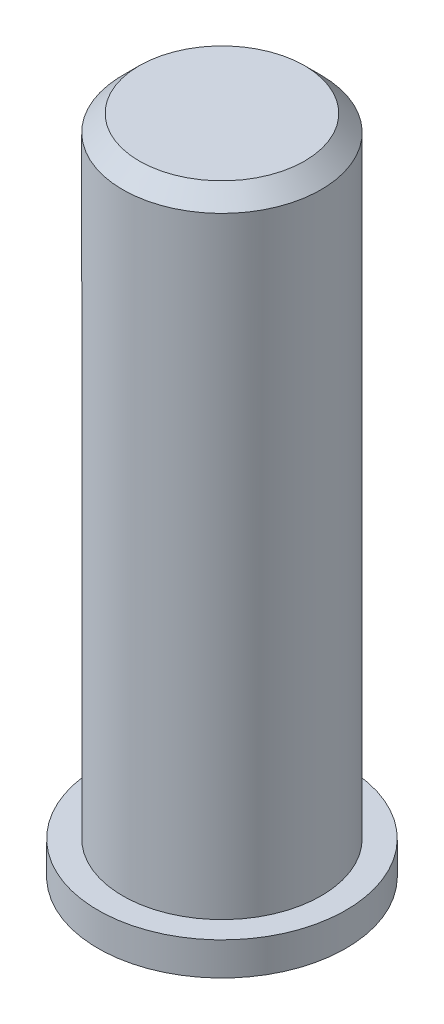
ISO-10303-21;
HEADER;
FILE_DESCRIPTION(('STEP AP214'),'2;1');
FILE_NAME('part.step','',(''),(''),'','','');
FILE_SCHEMA(('AUTOMOTIVE_DESIGN { 1 0 10303 214 1 1 1 1 }'));
ENDSEC;
DATA;
#1=APPLICATION_CONTEXT('core data for automotive mechanical design processes');
#2=APPLICATION_PROTOCOL_DEFINITION('international standard','automotive_design',2000,#1);
#3=PRODUCT_CONTEXT('',#1,'mechanical');
#4=PRODUCT('Part','Part','',(#3));
#5=PRODUCT_RELATED_PRODUCT_CATEGORY('part','',(#4));
#6=PRODUCT_DEFINITION_FORMATION('','',#4);
#7=PRODUCT_DEFINITION_CONTEXT('part definition',#1,'design');
#8=PRODUCT_DEFINITION('design','',#6,#7);
#9=PRODUCT_DEFINITION_SHAPE('','',#8);
#10=(LENGTH_UNIT() NAMED_UNIT(*) SI_UNIT(.MILLI.,.METRE.));
#11=(NAMED_UNIT(*) PLANE_ANGLE_UNIT() SI_UNIT($,.RADIAN.));
#12=(NAMED_UNIT(*) SI_UNIT($,.STERADIAN.) SOLID_ANGLE_UNIT());
#13=UNCERTAINTY_MEASURE_WITH_UNIT(LENGTH_MEASURE(1.E-05),#10,'distance_accuracy_value','');
#14=(GEOMETRIC_REPRESENTATION_CONTEXT(3) GLOBAL_UNCERTAINTY_ASSIGNED_CONTEXT((#13)) GLOBAL_UNIT_ASSIGNED_CONTEXT((#10,
#11,#12)) REPRESENTATION_CONTEXT('',''));
#15=CARTESIAN_POINT('',(0.,0.,0.));
#16=DIRECTION('',(0.,0.,1.));
#17=DIRECTION('',(1.,0.,0.));
#18=AXIS2_PLACEMENT_3D('',#15,#16,#17);
#19=CARTESIAN_POINT('',(0.,0.,0.));
#20=DIRECTION('',(0.,1.,0.));
#21=DIRECTION('',(0.,0.,1.));
#22=AXIS2_PLACEMENT_3D('',#19,#20,#21);
#23=PLANE('',#22);
#24=CARTESIAN_POINT('',(0.,0.,0.));
#25=DIRECTION('',(0.,-1.,0.));
#26=DIRECTION('',(0.,0.,-1.));
#27=AXIS2_PLACEMENT_3D('',#24,#25,#26);
#28=CIRCLE('',#27,3.75);
#29=CARTESIAN_POINT('',(0.,0.,-3.75));
#30=VERTEX_POINT('',#29);
#31=EDGE_CURVE('E49',#30,#30,#28,.T.);
#32=ORIENTED_EDGE('',*,*,#31,.T.);
#33=EDGE_LOOP('',(#32));
#34=FACE_BOUND('',#33,.T.);
#35=CARTESIAN_POINT('',(0.,0.,0.));
#36=DIRECTION('',(0.,1.,0.));
#37=DIRECTION('',(0.,0.,1.));
#38=AXIS2_PLACEMENT_3D('',#35,#36,#37);
#39=CIRCLE('',#38,0.375);
#40=CARTESIAN_POINT('',(0.,0.,0.375));
#41=VERTEX_POINT('',#40);
#42=EDGE_CURVE('E10',#41,#41,#39,.F.);
#43=ORIENTED_EDGE('',*,*,#42,.F.);
#44=EDGE_LOOP('',(#43));
#45=FACE_BOUND('',#44,.T.);
#46=ADVANCED_FACE('F26',(#34,#45),#23,.F.);
#47=CARTESIAN_POINT('',(0.,20.,0.));
#48=DIRECTION('',(0.,-1.,0.));
#49=DIRECTION('',(0.,0.,-1.));
#50=AXIS2_PLACEMENT_3D('',#47,#48,#49);
#51=CYLINDRICAL_SURFACE('',#50,3.);
#52=CARTESIAN_POINT('',(0.,19.5,0.));
#53=DIRECTION('',(0.,1.,0.));
#54=DIRECTION('',(0.,0.,1.));
#55=AXIS2_PLACEMENT_3D('',#52,#53,#54);
#56=CIRCLE('',#55,3.);
#57=CARTESIAN_POINT('',(0.,19.5,3.));
#58=VERTEX_POINT('',#57);
#59=EDGE_CURVE('E37',#58,#58,#56,.F.);
#60=ORIENTED_EDGE('',*,*,#59,.T.);
#61=EDGE_LOOP('',(#60));
#62=FACE_BOUND('',#61,.T.);
#63=CARTESIAN_POINT('',(0.,1.,0.));
#64=DIRECTION('',(0.,-1.,0.));
#65=DIRECTION('',(0.,0.,-1.));
#66=AXIS2_PLACEMENT_3D('',#63,#64,#65);
#67=CIRCLE('',#66,3.);
#68=CARTESIAN_POINT('',(0.,1.,-3.));
#69=VERTEX_POINT('',#68);
#70=EDGE_CURVE('E33',#69,#69,#67,.T.);
#71=ORIENTED_EDGE('',*,*,#70,.F.);
#72=EDGE_LOOP('',(#71));
#73=FACE_BOUND('',#72,.T.);
#74=ADVANCED_FACE('F28',(#62,#73),#51,.T.);
#75=CARTESIAN_POINT('',(0.,20.,0.));
#76=DIRECTION('',(0.,1.,0.));
#77=DIRECTION('',(0.,0.,1.));
#78=AXIS2_PLACEMENT_3D('',#75,#76,#77);
#79=PLANE('',#78);
#80=CARTESIAN_POINT('',(0.,20.,0.));
#81=DIRECTION('',(0.,1.,0.));
#82=DIRECTION('',(0.,0.,1.));
#83=AXIS2_PLACEMENT_3D('',#80,#81,#82);
#84=CIRCLE('',#83,2.5);
#85=CARTESIAN_POINT('',(0.,20.,2.5));
#86=VERTEX_POINT('',#85);
#87=EDGE_CURVE('E41',#86,#86,#84,.T.);
#88=ORIENTED_EDGE('',*,*,#87,.T.);
#89=EDGE_LOOP('',(#88));
#90=FACE_BOUND('',#89,.T.);
#91=ADVANCED_FACE('F77',(#90),#79,.T.);
#92=CARTESIAN_POINT('',(0.,20.,0.));
#93=DIRECTION('',(0.,-1.,0.));
#94=DIRECTION('',(0.,0.,-1.));
#95=AXIS2_PLACEMENT_3D('',#92,#93,#94);
#96=CONICAL_SURFACE('',#95,2.5,0.785398163397446);
#97=ORIENTED_EDGE('',*,*,#59,.F.);
#98=EDGE_LOOP('',(#97));
#99=FACE_BOUND('',#98,.T.);
#100=ORIENTED_EDGE('',*,*,#87,.F.);
#101=EDGE_LOOP('',(#100));
#102=FACE_BOUND('',#101,.T.);
#103=ADVANCED_FACE('F81',(#99,#102),#96,.T.);
#104=CARTESIAN_POINT('',(0.,1.,0.));
#105=DIRECTION('',(0.,-1.,0.));
#106=DIRECTION('',(0.,0.,-1.));
#107=AXIS2_PLACEMENT_3D('',#104,#105,#106);
#108=PLANE('',#107);
#109=CARTESIAN_POINT('',(0.,1.,0.));
#110=DIRECTION('',(0.,-1.,0.));
#111=DIRECTION('',(0.,0.,-1.));
#112=AXIS2_PLACEMENT_3D('',#109,#110,#111);
#113=CIRCLE('',#112,3.75);
#114=CARTESIAN_POINT('',(0.,1.,-3.75));
#115=VERTEX_POINT('',#114);
#116=EDGE_CURVE('E46',#115,#115,#113,.T.);
#117=ORIENTED_EDGE('',*,*,#116,.F.);
#118=EDGE_LOOP('',(#117));
#119=FACE_BOUND('',#118,.T.);
#120=ORIENTED_EDGE('',*,*,#70,.T.);
#121=EDGE_LOOP('',(#120));
#122=FACE_BOUND('',#121,.T.);
#123=ADVANCED_FACE('F68',(#119,#122),#108,.F.);
#124=CARTESIAN_POINT('',(0.,1.,0.));
#125=DIRECTION('',(0.,-1.,0.));
#126=DIRECTION('',(0.,0.,-1.));
#127=AXIS2_PLACEMENT_3D('',#124,#125,#126);
#128=CYLINDRICAL_SURFACE('',#127,3.75);
#129=ORIENTED_EDGE('',*,*,#116,.T.);
#130=EDGE_LOOP('',(#129));
#131=FACE_BOUND('',#130,.T.);
#132=ORIENTED_EDGE('',*,*,#31,.F.);
#133=EDGE_LOOP('',(#132));
#134=FACE_BOUND('',#133,.T.);
#135=ADVANCED_FACE('F60',(#131,#134),#128,.T.);
#136=CARTESIAN_POINT('',(0.,-0.8,0.));
#137=DIRECTION('',(0.,1.,0.));
#138=DIRECTION('',(0.,0.,1.));
#139=AXIS2_PLACEMENT_3D('',#136,#137,#138);
#140=CYLINDRICAL_SURFACE('',#139,0.375);
#141=CARTESIAN_POINT('',(0.,-0.8,0.));
#142=DIRECTION('',(0.,-1.,0.));
#143=DIRECTION('',(0.,0.,-1.));
#144=AXIS2_PLACEMENT_3D('',#141,#142,#143);
#145=CIRCLE('',#144,0.375);
#146=CARTESIAN_POINT('',(0.,-0.8,-0.375));
#147=VERTEX_POINT('',#146);
#148=EDGE_CURVE('E52',#147,#147,#145,.T.);
#149=ORIENTED_EDGE('',*,*,#148,.F.);
#150=EDGE_LOOP('',(#149));
#151=FACE_BOUND('',#150,.T.);
#152=ORIENTED_EDGE('',*,*,#42,.T.);
#153=EDGE_LOOP('',(#152));
#154=FACE_BOUND('',#153,.T.);
#155=ADVANCED_FACE('F58',(#151,#154),#140,.T.);
#156=CARTESIAN_POINT('',(0.,-0.8,0.));
#157=DIRECTION('',(0.,-1.,0.));
#158=DIRECTION('',(0.,0.,-1.));
#159=AXIS2_PLACEMENT_3D('',#156,#157,#158);
#160=PLANE('',#159);
#161=ORIENTED_EDGE('',*,*,#148,.T.);
#162=EDGE_LOOP('',(#161));
#163=FACE_BOUND('',#162,.T.);
#164=ADVANCED_FACE('F56',(#163),#160,.T.);
#165=CLOSED_SHELL('',(#46,#74,#91,#103,#123,#135,#155,#164));
#166=MANIFOLD_SOLID_BREP('B2',#165);
#167=ADVANCED_BREP_SHAPE_REPRESENTATION('',(#18,#166),#14);
#168=SHAPE_DEFINITION_REPRESENTATION(#9,#167);
ENDSEC;
END-ISO-10303-21;
